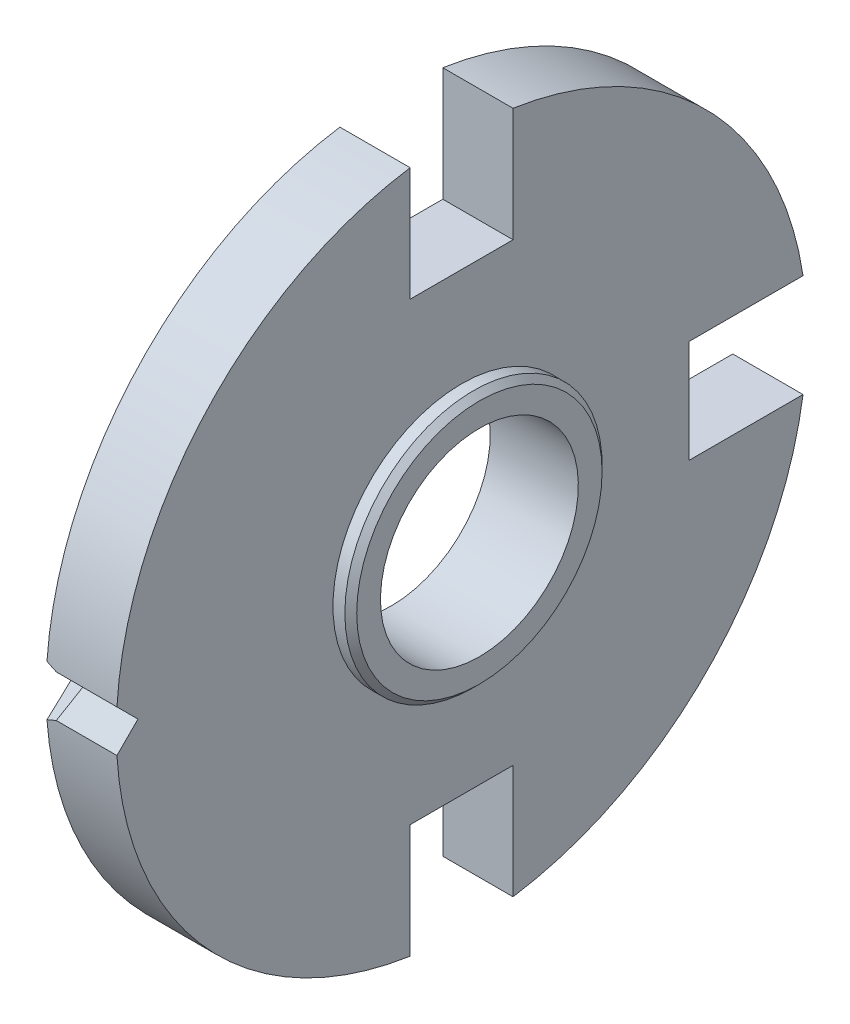
ISO-10303-21;
HEADER;
FILE_DESCRIPTION(('STEP AP214'),'2;1');
FILE_NAME('part.step','',(''),(''),'','','');
FILE_SCHEMA(('AUTOMOTIVE_DESIGN { 1 0 10303 214 1 1 1 1 }'));
ENDSEC;
DATA;
#1=APPLICATION_CONTEXT('core data for automotive mechanical design processes');
#2=APPLICATION_PROTOCOL_DEFINITION('international standard','automotive_design',2000,#1);
#3=PRODUCT_CONTEXT('',#1,'mechanical');
#4=PRODUCT('Part','Part','',(#3));
#5=PRODUCT_RELATED_PRODUCT_CATEGORY('part','',(#4));
#6=PRODUCT_DEFINITION_FORMATION('','',#4);
#7=PRODUCT_DEFINITION_CONTEXT('part definition',#1,'design');
#8=PRODUCT_DEFINITION('design','',#6,#7);
#9=PRODUCT_DEFINITION_SHAPE('','',#8);
#10=(LENGTH_UNIT() NAMED_UNIT(*) SI_UNIT(.MILLI.,.METRE.));
#11=(NAMED_UNIT(*) PLANE_ANGLE_UNIT() SI_UNIT($,.RADIAN.));
#12=(NAMED_UNIT(*) SI_UNIT($,.STERADIAN.) SOLID_ANGLE_UNIT());
#13=UNCERTAINTY_MEASURE_WITH_UNIT(LENGTH_MEASURE(1.E-05),#10,'distance_accuracy_value','');
#14=(GEOMETRIC_REPRESENTATION_CONTEXT(3) GLOBAL_UNCERTAINTY_ASSIGNED_CONTEXT((#13)) GLOBAL_UNIT_ASSIGNED_CONTEXT((#10,
#11,#12)) REPRESENTATION_CONTEXT('',''));
#15=CARTESIAN_POINT('',(0.,0.,0.));
#16=DIRECTION('',(0.,0.,1.));
#17=DIRECTION('',(1.,0.,0.));
#18=AXIS2_PLACEMENT_3D('',#15,#16,#17);
#19=CARTESIAN_POINT('',(122.75,0.,0.));
#20=DIRECTION('',(-1.,0.,0.));
#21=DIRECTION('',(0.,1.,0.));
#22=AXIS2_PLACEMENT_3D('',#19,#20,#21);
#23=CYLINDRICAL_SURFACE('',#22,6.5);
#24=CARTESIAN_POINT('',(122.3,0.,0.));
#25=DIRECTION('',(-1.,0.,0.));
#26=DIRECTION('',(0.,-1.,0.));
#27=AXIS2_PLACEMENT_3D('',#24,#25,#26);
#28=CIRCLE('',#27,6.5);
#29=CARTESIAN_POINT('',(122.3,-6.5,0.));
#30=VERTEX_POINT('',#29);
#31=EDGE_CURVE('E264',#30,#30,#28,.T.);
#32=ORIENTED_EDGE('',*,*,#31,.F.);
#33=DIRECTION('',(1.,0.,0.));
#34=VECTOR('',#33,1.);
#35=CARTESIAN_POINT('',(122.75,-6.5,0.));
#36=LINE('',#35,#34);
#37=CARTESIAN_POINT('',(122.9,-6.5,0.));
#38=VERTEX_POINT('',#37);
#39=EDGE_CURVE('E11',#30,#38,#36,.T.);
#40=ORIENTED_EDGE('',*,*,#39,.T.);
#41=CARTESIAN_POINT('',(122.9,0.,0.));
#42=DIRECTION('',(1.,0.,0.));
#43=DIRECTION('',(0.,0.,1.));
#44=AXIS2_PLACEMENT_3D('',#41,#42,#43);
#45=CIRCLE('',#44,6.5);
#46=CARTESIAN_POINT('',(122.9,0.,6.5));
#47=VERTEX_POINT('',#46);
#48=EDGE_CURVE('E28',#47,#38,#45,.T.);
#49=ORIENTED_EDGE('',*,*,#48,.F.);
#50=CARTESIAN_POINT('',(122.9,0.,0.));
#51=DIRECTION('',(1.,0.,0.));
#52=DIRECTION('',(0.,0.,1.));
#53=AXIS2_PLACEMENT_3D('',#50,#51,#52);
#54=CIRCLE('',#53,6.5);
#55=EDGE_CURVE('E231',#38,#47,#54,.T.);
#56=ORIENTED_EDGE('',*,*,#55,.F.);
#57=ORIENTED_EDGE('',*,*,#39,.F.);
#58=EDGE_LOOP('',(#32,#40,#49,#56,#57));
#59=FACE_BOUND('',#58,.T.);
#60=ADVANCED_FACE('F17',(#59),#23,.T.);
#61=CARTESIAN_POINT('',(123.05,0.,0.));
#62=DIRECTION('',(-1.,0.,0.));
#63=DIRECTION('',(0.,0.,-1.));
#64=AXIS2_PLACEMENT_3D('',#61,#62,#63);
#65=CONICAL_SURFACE('',#64,6.35,0.785398163397448);
#66=ORIENTED_EDGE('',*,*,#55,.T.);
#67=DIRECTION('',(0.707106781186548,0.,-0.707106781186548));
#68=VECTOR('',#67,1.);
#69=CARTESIAN_POINT('',(123.05,0.,6.35));
#70=LINE('',#69,#68);
#71=CARTESIAN_POINT('',(123.2,0.,6.2));
#72=VERTEX_POINT('',#71);
#73=EDGE_CURVE('E228',#47,#72,#70,.T.);
#74=ORIENTED_EDGE('',*,*,#73,.T.);
#75=CARTESIAN_POINT('',(123.2,0.,0.));
#76=DIRECTION('',(1.,0.,0.));
#77=DIRECTION('',(0.,0.,-1.));
#78=AXIS2_PLACEMENT_3D('',#75,#76,#77);
#79=CIRCLE('',#78,6.2);
#80=EDGE_CURVE('E344',#72,#72,#79,.T.);
#81=ORIENTED_EDGE('',*,*,#80,.F.);
#82=ORIENTED_EDGE('',*,*,#73,.F.);
#83=ORIENTED_EDGE('',*,*,#48,.T.);
#84=EDGE_LOOP('',(#66,#74,#81,#82,#83));
#85=FACE_BOUND('',#84,.T.);
#86=ADVANCED_FACE('F585',(#85),#65,.T.);
#87=CARTESIAN_POINT('',(123.2,5.75,0.));
#88=DIRECTION('',(1.,0.,0.));
#89=DIRECTION('',(0.,1.,0.));
#90=AXIS2_PLACEMENT_3D('',#87,#88,#89);
#91=PLANE('',#90);
#92=CARTESIAN_POINT('',(123.2,0.,0.));
#93=DIRECTION('',(-1.,0.,0.));
#94=DIRECTION('',(0.,-1.,0.));
#95=AXIS2_PLACEMENT_3D('',#92,#93,#94);
#96=CIRCLE('',#95,5.);
#97=CARTESIAN_POINT('',(123.2,-5.,0.));
#98=VERTEX_POINT('',#97);
#99=EDGE_CURVE('E222',#98,#98,#96,.T.);
#100=ORIENTED_EDGE('',*,*,#99,.T.);
#101=EDGE_LOOP('',(#100));
#102=FACE_BOUND('',#101,.T.);
#103=ORIENTED_EDGE('',*,*,#80,.T.);
#104=EDGE_LOOP('',(#103));
#105=FACE_BOUND('',#104,.T.);
#106=ADVANCED_FACE('F583',(#102,#105),#91,.T.);
#107=CARTESIAN_POINT('',(120.975,0.,0.));
#108=DIRECTION('',(-1.,0.,0.));
#109=DIRECTION('',(0.,1.,0.));
#110=AXIS2_PLACEMENT_3D('',#107,#108,#109);
#111=CYLINDRICAL_SURFACE('',#110,5.);
#112=ORIENTED_EDGE('',*,*,#99,.F.);
#113=DIRECTION('',(-1.,0.,0.));
#114=VECTOR('',#113,1.);
#115=CARTESIAN_POINT('',(120.975,-5.,0.));
#116=LINE('',#115,#114);
#117=CARTESIAN_POINT('',(118.75,-5.,0.));
#118=VERTEX_POINT('',#117);
#119=EDGE_CURVE('E225',#98,#118,#116,.T.);
#120=ORIENTED_EDGE('',*,*,#119,.T.);
#121=CARTESIAN_POINT('',(118.75,0.,0.));
#122=DIRECTION('',(1.,0.,0.));
#123=DIRECTION('',(0.,1.,0.));
#124=AXIS2_PLACEMENT_3D('',#121,#122,#123);
#125=CIRCLE('',#124,5.);
#126=EDGE_CURVE('E328',#118,#118,#125,.T.);
#127=ORIENTED_EDGE('',*,*,#126,.F.);
#128=ORIENTED_EDGE('',*,*,#119,.F.);
#129=EDGE_LOOP('',(#112,#120,#127,#128));
#130=FACE_BOUND('',#129,.T.);
#131=ADVANCED_FACE('F665',(#130),#111,.F.);
#132=CARTESIAN_POINT('',(118.75,2.6,-11.5));
#133=DIRECTION('',(0.,1.,0.));
#134=DIRECTION('',(1.,0.,0.));
#135=AXIS2_PLACEMENT_3D('',#132,#133,#134);
#136=PLANE('',#135);
#137=DIRECTION('',(0.,0.,1.));
#138=VECTOR('',#137,1.);
#139=CARTESIAN_POINT('',(122.3,2.6,-17.25521660252));
#140=LINE('',#139,#138);
#141=CARTESIAN_POINT('',(122.3,2.6,-17.25521660252));
#142=VERTEX_POINT('',#141);
#143=CARTESIAN_POINT('',(122.3,2.6,-11.5));
#144=VERTEX_POINT('',#143);
#145=EDGE_CURVE('E21',#142,#144,#140,.T.);
#146=ORIENTED_EDGE('',*,*,#145,.T.);
#147=DIRECTION('',(-1.,0.,0.));
#148=VECTOR('',#147,1.);
#149=CARTESIAN_POINT('',(122.3,2.6,-11.5));
#150=LINE('',#149,#148);
#151=CARTESIAN_POINT('',(118.75,2.6,-11.5));
#152=VERTEX_POINT('',#151);
#153=EDGE_CURVE('E226',#144,#152,#150,.T.);
#154=ORIENTED_EDGE('',*,*,#153,.T.);
#155=DIRECTION('',(0.,0.,-1.));
#156=VECTOR('',#155,1.);
#157=CARTESIAN_POINT('',(118.75,2.6,-11.5));
#158=LINE('',#157,#156);
#159=CARTESIAN_POINT('',(118.75,2.6,-17.25521660252));
#160=VERTEX_POINT('',#159);
#161=EDGE_CURVE('E243',#152,#160,#158,.T.);
#162=ORIENTED_EDGE('',*,*,#161,.T.);
#163=DIRECTION('',(-1.,0.,0.));
#164=VECTOR('',#163,1.);
#165=CARTESIAN_POINT('',(122.3,2.6,-17.25521660252));
#166=LINE('',#165,#164);
#167=EDGE_CURVE('E283',#142,#160,#166,.T.);
#168=ORIENTED_EDGE('',*,*,#167,.F.);
#169=EDGE_LOOP('',(#146,#154,#162,#168));
#170=FACE_BOUND('',#169,.T.);
#171=ADVANCED_FACE('F624',(#170),#136,.F.);
#172=CARTESIAN_POINT('',(118.75,-2.6,-11.5));
#173=DIRECTION('',(0.,0.,1.));
#174=DIRECTION('',(1.,0.,0.));
#175=AXIS2_PLACEMENT_3D('',#172,#173,#174);
#176=PLANE('',#175);
#177=DIRECTION('',(0.,-1.,0.));
#178=VECTOR('',#177,1.);
#179=CARTESIAN_POINT('',(122.3,2.6,-11.5));
#180=LINE('',#179,#178);
#181=CARTESIAN_POINT('',(122.3,-2.6,-11.5));
#182=VERTEX_POINT('',#181);
#183=EDGE_CURVE('E268',#144,#182,#180,.T.);
#184=ORIENTED_EDGE('',*,*,#183,.T.);
#185=DIRECTION('',(-1.,0.,0.));
#186=VECTOR('',#185,1.);
#187=CARTESIAN_POINT('',(122.3,-2.6,-11.5));
#188=LINE('',#187,#186);
#189=CARTESIAN_POINT('',(118.75,-2.6,-11.5));
#190=VERTEX_POINT('',#189);
#191=EDGE_CURVE('E282',#182,#190,#188,.T.);
#192=ORIENTED_EDGE('',*,*,#191,.T.);
#193=DIRECTION('',(0.,1.,0.));
#194=VECTOR('',#193,1.);
#195=CARTESIAN_POINT('',(118.75,-2.6,-11.5));
#196=LINE('',#195,#194);
#197=EDGE_CURVE('E238',#190,#152,#196,.T.);
#198=ORIENTED_EDGE('',*,*,#197,.T.);
#199=ORIENTED_EDGE('',*,*,#153,.F.);
#200=EDGE_LOOP('',(#184,#192,#198,#199));
#201=FACE_BOUND('',#200,.T.);
#202=ADVANCED_FACE('F620',(#201),#176,.F.);
#203=CARTESIAN_POINT('',(118.75,-2.6,-17.45));
#204=DIRECTION('',(0.,-1.,0.));
#205=DIRECTION('',(0.,0.,-1.));
#206=AXIS2_PLACEMENT_3D('',#203,#204,#205);
#207=PLANE('',#206);
#208=DIRECTION('',(0.,0.,-1.));
#209=VECTOR('',#208,1.);
#210=CARTESIAN_POINT('',(122.3,-2.6,-11.5));
#211=LINE('',#210,#209);
#212=CARTESIAN_POINT('',(122.3,-2.6,-17.25521660252));
#213=VERTEX_POINT('',#212);
#214=EDGE_CURVE('E220',#182,#213,#211,.T.);
#215=ORIENTED_EDGE('',*,*,#214,.T.);
#216=DIRECTION('',(1.,0.,0.));
#217=VECTOR('',#216,1.);
#218=CARTESIAN_POINT('',(118.75,-2.6,-17.25521660252));
#219=LINE('',#218,#217);
#220=CARTESIAN_POINT('',(118.75,-2.6,-17.25521660252));
#221=VERTEX_POINT('',#220);
#222=EDGE_CURVE('E316',#221,#213,#219,.T.);
#223=ORIENTED_EDGE('',*,*,#222,.F.);
#224=DIRECTION('',(0.,0.,1.));
#225=VECTOR('',#224,1.);
#226=CARTESIAN_POINT('',(118.75,-2.6,-17.25521660252));
#227=LINE('',#226,#225);
#228=EDGE_CURVE('E242',#221,#190,#227,.T.);
#229=ORIENTED_EDGE('',*,*,#228,.T.);
#230=ORIENTED_EDGE('',*,*,#191,.F.);
#231=EDGE_LOOP('',(#215,#223,#229,#230));
#232=FACE_BOUND('',#231,.T.);
#233=ADVANCED_FACE('F613',(#232),#207,.F.);
#234=CARTESIAN_POINT('',(120.525,0.,0.));
#235=DIRECTION('',(-1.,0.,0.));
#236=DIRECTION('',(0.,1.,0.));
#237=AXIS2_PLACEMENT_3D('',#234,#235,#236);
#238=CYLINDRICAL_SURFACE('',#237,17.45);
#239=ORIENTED_EDGE('',*,*,#222,.T.);
#240=CARTESIAN_POINT('',(122.3,0.,0.));
#241=DIRECTION('',(1.,0.,0.));
#242=DIRECTION('',(0.,-0.988837627651771,-0.148997134670496));
#243=AXIS2_PLACEMENT_3D('',#240,#241,#242);
#244=CIRCLE('',#243,17.45);
#245=CARTESIAN_POINT('',(122.3,-17.25521660252,-2.6));
#246=VERTEX_POINT('',#245);
#247=EDGE_CURVE('E216',#246,#213,#244,.T.);
#248=ORIENTED_EDGE('',*,*,#247,.F.);
#249=DIRECTION('',(-1.,0.,0.));
#250=VECTOR('',#249,1.);
#251=CARTESIAN_POINT('',(122.3,-17.25521660252,-2.6));
#252=LINE('',#251,#250);
#253=CARTESIAN_POINT('',(118.75,-17.25521660252,-2.6));
#254=VERTEX_POINT('',#253);
#255=EDGE_CURVE('E254',#246,#254,#252,.T.);
#256=ORIENTED_EDGE('',*,*,#255,.T.);
#257=CARTESIAN_POINT('',(118.75,0.,0.));
#258=DIRECTION('',(-1.,0.,0.));
#259=DIRECTION('',(0.,-0.148997134670496,-0.988837627651771));
#260=AXIS2_PLACEMENT_3D('',#257,#258,#259);
#261=CIRCLE('',#260,17.45);
#262=EDGE_CURVE('E208',#221,#254,#261,.T.);
#263=ORIENTED_EDGE('',*,*,#262,.F.);
#264=EDGE_LOOP('',(#239,#248,#256,#263));
#265=FACE_BOUND('',#264,.T.);
#266=ADVANCED_FACE('F608',(#265),#238,.T.);
#267=CARTESIAN_POINT('',(118.75,-11.5,-2.6));
#268=DIRECTION('',(0.,0.,-1.));
#269=DIRECTION('',(0.,-1.,0.));
#270=AXIS2_PLACEMENT_3D('',#267,#268,#269);
#271=PLANE('',#270);
#272=ORIENTED_EDGE('',*,*,#255,.F.);
#273=DIRECTION('',(0.,1.,0.));
#274=VECTOR('',#273,1.);
#275=CARTESIAN_POINT('',(122.3,-17.25521660252,-2.6));
#276=LINE('',#275,#274);
#277=CARTESIAN_POINT('',(122.3,-11.5,-2.6));
#278=VERTEX_POINT('',#277);
#279=EDGE_CURVE('E221',#246,#278,#276,.T.);
#280=ORIENTED_EDGE('',*,*,#279,.T.);
#281=DIRECTION('',(-1.,0.,0.));
#282=VECTOR('',#281,1.);
#283=CARTESIAN_POINT('',(122.3,-11.5,-2.6));
#284=LINE('',#283,#282);
#285=CARTESIAN_POINT('',(118.75,-11.5,-2.6));
#286=VERTEX_POINT('',#285);
#287=EDGE_CURVE('E186',#278,#286,#284,.T.);
#288=ORIENTED_EDGE('',*,*,#287,.T.);
#289=DIRECTION('',(0.,-1.,0.));
#290=VECTOR('',#289,1.);
#291=CARTESIAN_POINT('',(118.75,-11.5,-2.6));
#292=LINE('',#291,#290);
#293=EDGE_CURVE('E201',#286,#254,#292,.T.);
#294=ORIENTED_EDGE('',*,*,#293,.T.);
#295=EDGE_LOOP('',(#272,#280,#288,#294));
#296=FACE_BOUND('',#295,.T.);
#297=ADVANCED_FACE('F605',(#296),#271,.F.);
#298=CARTESIAN_POINT('',(118.75,-11.5,2.6));
#299=DIRECTION('',(0.,1.,0.));
#300=DIRECTION('',(1.,0.,0.));
#301=AXIS2_PLACEMENT_3D('',#298,#299,#300);
#302=PLANE('',#301);
#303=DIRECTION('',(0.,0.,1.));
#304=VECTOR('',#303,1.);
#305=CARTESIAN_POINT('',(122.3,-11.5,-2.6));
#306=LINE('',#305,#304);
#307=CARTESIAN_POINT('',(122.3,-11.5,2.6));
#308=VERTEX_POINT('',#307);
#309=EDGE_CURVE('E181',#278,#308,#306,.T.);
#310=ORIENTED_EDGE('',*,*,#309,.T.);
#311=DIRECTION('',(-1.,0.,0.));
#312=VECTOR('',#311,1.);
#313=CARTESIAN_POINT('',(122.3,-11.5,2.6));
#314=LINE('',#313,#312);
#315=CARTESIAN_POINT('',(118.75,-11.5,2.6));
#316=VERTEX_POINT('',#315);
#317=EDGE_CURVE('E174',#308,#316,#314,.T.);
#318=ORIENTED_EDGE('',*,*,#317,.T.);
#319=DIRECTION('',(0.,0.,-1.));
#320=VECTOR('',#319,1.);
#321=CARTESIAN_POINT('',(118.75,-11.5,2.6));
#322=LINE('',#321,#320);
#323=EDGE_CURVE('E178',#316,#286,#322,.T.);
#324=ORIENTED_EDGE('',*,*,#323,.T.);
#325=ORIENTED_EDGE('',*,*,#287,.F.);
#326=EDGE_LOOP('',(#310,#318,#324,#325));
#327=FACE_BOUND('',#326,.T.);
#328=ADVANCED_FACE('F176',(#327),#302,.F.);
#329=CARTESIAN_POINT('',(118.75,-17.45,2.6));
#330=DIRECTION('',(0.,0.,1.));
#331=DIRECTION('',(1.,0.,0.));
#332=AXIS2_PLACEMENT_3D('',#329,#330,#331);
#333=PLANE('',#332);
#334=DIRECTION('',(0.,-1.,0.));
#335=VECTOR('',#334,1.);
#336=CARTESIAN_POINT('',(122.3,-11.5,2.6));
#337=LINE('',#336,#335);
#338=CARTESIAN_POINT('',(122.3,-17.25521660252,2.6));
#339=VERTEX_POINT('',#338);
#340=EDGE_CURVE('E434',#308,#339,#337,.T.);
#341=ORIENTED_EDGE('',*,*,#340,.T.);
#342=DIRECTION('',(1.,0.,0.));
#343=VECTOR('',#342,1.);
#344=CARTESIAN_POINT('',(118.75,-17.25521660252,2.6));
#345=LINE('',#344,#343);
#346=CARTESIAN_POINT('',(118.75,-17.25521660252,2.6));
#347=VERTEX_POINT('',#346);
#348=EDGE_CURVE('E187',#347,#339,#345,.T.);
#349=ORIENTED_EDGE('',*,*,#348,.F.);
#350=DIRECTION('',(0.,1.,0.));
#351=VECTOR('',#350,1.);
#352=CARTESIAN_POINT('',(118.75,-17.25521660252,2.6));
#353=LINE('',#352,#351);
#354=EDGE_CURVE('E190',#347,#316,#353,.T.);
#355=ORIENTED_EDGE('',*,*,#354,.T.);
#356=ORIENTED_EDGE('',*,*,#317,.F.);
#357=EDGE_LOOP('',(#341,#349,#355,#356));
#358=FACE_BOUND('',#357,.T.);
#359=ADVANCED_FACE('F191',(#358),#333,.F.);
#360=CARTESIAN_POINT('',(120.525,0.,0.));
#361=DIRECTION('',(-1.,0.,0.));
#362=DIRECTION('',(0.,1.,0.));
#363=AXIS2_PLACEMENT_3D('',#360,#361,#362);
#364=CYLINDRICAL_SURFACE('',#363,17.45);
#365=CARTESIAN_POINT('',(118.750000000729,-1.27656980975551,17.4032430748071));
#366=CARTESIAN_POINT('',(118.914146337813,-1.21113997958318,17.4080425104925));
#367=CARTESIAN_POINT('',(119.075776758169,-1.13966539592839,17.412913506836));
#368=CARTESIAN_POINT('',(119.235503689173,-1.06303552015676,17.4175904040394));
#369=(BOUNDED_CURVE() B_SPLINE_CURVE(3,(#365,#366,#367,#368),.UNSPECIFIED.,.F.,
.F.) B_SPLINE_CURVE_WITH_KNOTS((4,4),(-1.84464061663477,-1.7865873168469),
.UNSPECIFIED.) CURVE() GEOMETRIC_REPRESENTATION_ITEM() RATIONAL_B_SPLINE_CURVE((1.,1.,1.,1.)) REPRESENTATION_ITEM(''));
#370=CARTESIAN_POINT('',(118.750000000398,-1.27656980889565,17.4032430744201));
#371=VERTEX_POINT('',#370);
#372=CARTESIAN_POINT('',(119.235503689117,-1.06303552007139,17.4175904045304));
#373=VERTEX_POINT('',#372);
#374=EDGE_CURVE('E311',#371,#373,#369,.T.);
#375=ORIENTED_EDGE('',*,*,#374,.F.);
#376=CARTESIAN_POINT('',(118.75,0.,0.));
#377=DIRECTION('',(-1.,0.,0.));
#378=DIRECTION('',(0.,-0.988837627651771,0.148997134670496));
#379=AXIS2_PLACEMENT_3D('',#376,#377,#378);
#380=CIRCLE('',#379,17.45);
#381=EDGE_CURVE('E195',#347,#371,#380,.T.);
#382=ORIENTED_EDGE('',*,*,#381,.F.);
#383=ORIENTED_EDGE('',*,*,#348,.T.);
#384=CARTESIAN_POINT('',(122.3,0.,0.));
#385=DIRECTION('',(1.,0.,0.));
#386=DIRECTION('',(0.,-0.0609189409234106,0.998142716567511));
#387=AXIS2_PLACEMENT_3D('',#384,#385,#386);
#388=CIRCLE('',#387,17.45);
#389=CARTESIAN_POINT('',(122.3,-1.063035519113,17.4175904041));
#390=VERTEX_POINT('',#389);
#391=EDGE_CURVE('E299',#390,#339,#388,.T.);
#392=ORIENTED_EDGE('',*,*,#391,.F.);
#393=DIRECTION('',(-1.,0.,0.));
#394=VECTOR('',#393,1.);
#395=CARTESIAN_POINT('',(120.525,-1.06303551911592,17.4175904041029));
#396=LINE('',#395,#394);
#397=EDGE_CURVE('E251',#390,#373,#396,.T.);
#398=ORIENTED_EDGE('',*,*,#397,.T.);
#399=EDGE_LOOP('',(#375,#382,#383,#392,#398));
#400=FACE_BOUND('',#399,.T.);
#401=ADVANCED_FACE('F368',(#400),#364,.T.);
#402=CARTESIAN_POINT('',(123.75,3.535533905933,19.89008879092));
#403=DIRECTION('',(0.,-0.707106781186548,0.707106781186548));
#404=DIRECTION('',(-1.,0.,0.));
#405=AXIS2_PLACEMENT_3D('',#402,#403,#404);
#406=PLANE('',#405);
#407=CARTESIAN_POINT('',(119.508692146074,-1.65201186064223E-12,16.3545548849853));
#408=CARTESIAN_POINT('',(119.372097918579,0.559124252789758,16.9136791377768));
#409=CARTESIAN_POINT('',(119.235503691084,1.06303552007375,17.4175904050608));
#410=(BOUNDED_CURVE() B_SPLINE_CURVE(2,(#407,#408,#409),.UNSPECIFIED.,.F.,
.F.) B_SPLINE_CURVE_WITH_KNOTS((3,3),(-0.343159029699654,-0.193709526089807),
.UNSPECIFIED.) CURVE() GEOMETRIC_REPRESENTATION_ITEM() RATIONAL_B_SPLINE_CURVE((1.,1.,1.)) REPRESENTATION_ITEM(''));
#411=CARTESIAN_POINT('',(119.5086921461,0.,16.35455488499));
#412=VERTEX_POINT('',#411);
#413=CARTESIAN_POINT('',(119.235503689119,1.06303552007139,17.4175904045304));
#414=VERTEX_POINT('',#413);
#415=EDGE_CURVE('E497',#412,#414,#410,.T.);
#416=ORIENTED_EDGE('',*,*,#415,.F.);
#417=DIRECTION('',(1.,0.,0.));
#418=VECTOR('',#417,1.);
#419=CARTESIAN_POINT('',(119.5086921461,0.,16.35455488499));
#420=LINE('',#419,#418);
#421=CARTESIAN_POINT('',(122.3,0.,16.35455488499));
#422=VERTEX_POINT('',#421);
#423=EDGE_CURVE('E247',#412,#422,#420,.T.);
#424=ORIENTED_EDGE('',*,*,#423,.T.);
#425=DIRECTION('',(0.,-0.707106781186597,-0.707106781186498));
#426=VECTOR('',#425,1.);
#427=CARTESIAN_POINT('',(122.3,1.063035519113,17.4175904041));
#428=LINE('',#427,#426);
#429=CARTESIAN_POINT('',(122.3,1.063035519113,17.4175904041));
#430=VERTEX_POINT('',#429);
#431=EDGE_CURVE('E259',#430,#422,#428,.T.);
#432=ORIENTED_EDGE('',*,*,#431,.F.);
#433=DIRECTION('',(1.,0.,0.));
#434=VECTOR('',#433,1.);
#435=CARTESIAN_POINT('',(120.525,1.06303551911592,17.4175904041029));
#436=LINE('',#435,#434);
#437=EDGE_CURVE('E317',#414,#430,#436,.T.);
#438=ORIENTED_EDGE('',*,*,#437,.F.);
#439=EDGE_LOOP('',(#416,#424,#432,#438));
#440=FACE_BOUND('',#439,.T.);
#441=ADVANCED_FACE('F19',(#440),#406,.T.);
#442=CARTESIAN_POINT('',(118.75,11.5,-2.6));
#443=DIRECTION('',(0.,-1.,0.));
#444=DIRECTION('',(0.,0.,-1.));
#445=AXIS2_PLACEMENT_3D('',#442,#443,#444);
#446=PLANE('',#445);
#447=DIRECTION('',(0.,0.,-1.));
#448=VECTOR('',#447,1.);
#449=CARTESIAN_POINT('',(122.3,11.5,2.6));
#450=LINE('',#449,#448);
#451=CARTESIAN_POINT('',(122.3,11.5,2.6));
#452=VERTEX_POINT('',#451);
#453=CARTESIAN_POINT('',(122.3,11.5,-2.6));
#454=VERTEX_POINT('',#453);
#455=EDGE_CURVE('E325',#452,#454,#450,.T.);
#456=ORIENTED_EDGE('',*,*,#455,.T.);
#457=DIRECTION('',(-1.,0.,0.));
#458=VECTOR('',#457,1.);
#459=CARTESIAN_POINT('',(122.3,11.5,-2.6));
#460=LINE('',#459,#458);
#461=CARTESIAN_POINT('',(118.75,11.5,-2.6));
#462=VERTEX_POINT('',#461);
#463=EDGE_CURVE('E271',#454,#462,#460,.T.);
#464=ORIENTED_EDGE('',*,*,#463,.T.);
#465=DIRECTION('',(0.,0.,1.));
#466=VECTOR('',#465,1.);
#467=CARTESIAN_POINT('',(118.75,11.5,-2.6));
#468=LINE('',#467,#466);
#469=CARTESIAN_POINT('',(118.75,11.5,2.6));
#470=VERTEX_POINT('',#469);
#471=EDGE_CURVE('E236',#462,#470,#468,.T.);
#472=ORIENTED_EDGE('',*,*,#471,.T.);
#473=DIRECTION('',(-1.,0.,0.));
#474=VECTOR('',#473,1.);
#475=CARTESIAN_POINT('',(122.3,11.5,2.6));
#476=LINE('',#475,#474);
#477=EDGE_CURVE('E501',#452,#470,#476,.T.);
#478=ORIENTED_EDGE('',*,*,#477,.F.);
#479=EDGE_LOOP('',(#456,#464,#472,#478));
#480=FACE_BOUND('',#479,.T.);
#481=ADVANCED_FACE('F635',(#480),#446,.F.);
#482=CARTESIAN_POINT('',(118.75,11.5,2.6));
#483=DIRECTION('',(0.,0.,1.));
#484=DIRECTION('',(1.,0.,0.));
#485=AXIS2_PLACEMENT_3D('',#482,#483,#484);
#486=PLANE('',#485);
#487=DIRECTION('',(0.,-1.,0.));
#488=VECTOR('',#487,1.);
#489=CARTESIAN_POINT('',(122.3,17.25521660252,2.6));
#490=LINE('',#489,#488);
#491=CARTESIAN_POINT('',(122.3,17.25521660252,2.6));
#492=VERTEX_POINT('',#491);
#493=EDGE_CURVE('E260',#492,#452,#490,.T.);
#494=ORIENTED_EDGE('',*,*,#493,.T.);
#495=ORIENTED_EDGE('',*,*,#477,.T.);
#496=DIRECTION('',(0.,1.,0.));
#497=VECTOR('',#496,1.);
#498=CARTESIAN_POINT('',(118.75,11.5,2.6));
#499=LINE('',#498,#497);
#500=CARTESIAN_POINT('',(118.75,17.25521660252,2.6));
#501=VERTEX_POINT('',#500);
#502=EDGE_CURVE('E232',#470,#501,#499,.T.);
#503=ORIENTED_EDGE('',*,*,#502,.T.);
#504=DIRECTION('',(-1.,0.,0.));
#505=VECTOR('',#504,1.);
#506=CARTESIAN_POINT('',(122.3,17.25521660252,2.6));
#507=LINE('',#506,#505);
#508=EDGE_CURVE('E320',#492,#501,#507,.T.);
#509=ORIENTED_EDGE('',*,*,#508,.F.);
#510=EDGE_LOOP('',(#494,#495,#503,#509));
#511=FACE_BOUND('',#510,.T.);
#512=ADVANCED_FACE('F642',(#511),#486,.F.);
#513=CARTESIAN_POINT('',(120.525,0.,0.));
#514=DIRECTION('',(-1.,0.,0.));
#515=DIRECTION('',(0.,1.,0.));
#516=AXIS2_PLACEMENT_3D('',#513,#514,#515);
#517=CYLINDRICAL_SURFACE('',#516,17.45);
#518=CARTESIAN_POINT('',(119.235503689174,1.06303552015677,17.4175904040394));
#519=CARTESIAN_POINT('',(119.075775332155,1.13966608006735,17.4129134650814));
#520=CARTESIAN_POINT('',(118.91413960424,1.2111426636524,17.4080423136107));
#521=CARTESIAN_POINT('',(118.75,1.27656981004698,17.4032430747857));
#522=(BOUNDED_CURVE() B_SPLINE_CURVE(3,(#518,#519,#520,#521),.UNSPECIFIED.,.F.,
.F.) B_SPLINE_CURVE_WITH_KNOTS((4,4),(-2.3418524631324,-2.28379916325835),
.UNSPECIFIED.) CURVE() GEOMETRIC_REPRESENTATION_ITEM() RATIONAL_B_SPLINE_CURVE((1.,1.,1.,1.)) REPRESENTATION_ITEM(''));
#523=CARTESIAN_POINT('',(118.75,1.276569810047,17.40324307479));
#524=VERTEX_POINT('',#523);
#525=EDGE_CURVE('E321',#414,#524,#522,.T.);
#526=ORIENTED_EDGE('',*,*,#525,.F.);
#527=ORIENTED_EDGE('',*,*,#437,.T.);
#528=CARTESIAN_POINT('',(122.3,0.,0.));
#529=DIRECTION('',(1.,0.,0.));
#530=DIRECTION('',(0.,0.988837627651771,0.148997134670496));
#531=AXIS2_PLACEMENT_3D('',#528,#529,#530);
#532=CIRCLE('',#531,17.45);
#533=EDGE_CURVE('E255',#492,#430,#532,.T.);
#534=ORIENTED_EDGE('',*,*,#533,.F.);
#535=ORIENTED_EDGE('',*,*,#508,.T.);
#536=CARTESIAN_POINT('',(118.75,0.,0.));
#537=DIRECTION('',(-1.,0.,0.));
#538=DIRECTION('',(0.,0.073155863039922,0.997320520045028));
#539=AXIS2_PLACEMENT_3D('',#536,#537,#538);
#540=CIRCLE('',#539,17.45);
#541=EDGE_CURVE('E237',#524,#501,#540,.T.);
#542=ORIENTED_EDGE('',*,*,#541,.F.);
#543=EDGE_LOOP('',(#526,#527,#534,#535,#542));
#544=FACE_BOUND('',#543,.T.);
#545=ADVANCED_FACE('F644',(#544),#517,.T.);
#546=CARTESIAN_POINT('',(116.7422,0.6382797957864,21.6787));
#547=DIRECTION('',(0.,-1.,0.));
#548=DIRECTION('',(0.,0.,-1.));
#549=AXIS2_PLACEMENT_3D('',#546,#547,#548);
#550=CONICAL_SURFACE('',#549,5.361720204214,0.785398163397448);
#551=CARTESIAN_POINT('',(118.75,1.27656981004942,17.4032430747883));
#552=CARTESIAN_POINT('',(118.75,0.726905357888125,16.7959859527784));
#553=CARTESIAN_POINT('',(118.75,8.99233154766219E-13,16.0246095196492));
#554=(BOUNDED_CURVE() B_SPLINE_CURVE(2,(#551,#552,#553),.UNSPECIFIED.,.F.,
.F.) B_SPLINE_CURVE_WITH_KNOTS((3,3),(5.55230447325372,5.80539197298008),
.UNSPECIFIED.) CURVE() GEOMETRIC_REPRESENTATION_ITEM() RATIONAL_B_SPLINE_CURVE((3.90166668816818,
3.6071139459456,3.27967938791246)) REPRESENTATION_ITEM(''));
#555=CARTESIAN_POINT('',(118.75,0.,16.02460951965));
#556=VERTEX_POINT('',#555);
#557=EDGE_CURVE('E300',#524,#556,#554,.T.);
#558=ORIENTED_EDGE('',*,*,#557,.T.);
#559=CARTESIAN_POINT('',(116.7422,0.,21.6787));
#560=DIRECTION('',(0.,-1.,0.));
#561=DIRECTION('',(0.334633333333302,0.,-0.942348413391906));
#562=AXIS2_PLACEMENT_3D('',#559,#560,#561);
#563=CIRCLE('',#562,6.);
#564=EDGE_CURVE('E305',#556,#412,#563,.T.);
#565=ORIENTED_EDGE('',*,*,#564,.T.);
#566=ORIENTED_EDGE('',*,*,#415,.T.);
#567=ORIENTED_EDGE('',*,*,#525,.T.);
#568=EDGE_LOOP('',(#558,#565,#566,#567));
#569=FACE_BOUND('',#568,.T.);
#570=ADVANCED_FACE('F600',(#569),#550,.F.);
#571=CARTESIAN_POINT('',(118.75,11.225,0.));
#572=DIRECTION('',(-1.,0.,0.));
#573=DIRECTION('',(0.,0.,1.));
#574=AXIS2_PLACEMENT_3D('',#571,#572,#573);
#575=PLANE('',#574);
#576=ORIENTED_EDGE('',*,*,#126,.T.);
#577=EDGE_LOOP('',(#576));
#578=FACE_BOUND('',#577,.T.);
#579=ORIENTED_EDGE('',*,*,#557,.F.);
#580=ORIENTED_EDGE('',*,*,#541,.T.);
#581=ORIENTED_EDGE('',*,*,#502,.F.);
#582=ORIENTED_EDGE('',*,*,#471,.F.);
#583=DIRECTION('',(0.,-1.,0.));
#584=VECTOR('',#583,1.);
#585=CARTESIAN_POINT('',(118.75,17.25521660252,-2.6));
#586=LINE('',#585,#584);
#587=CARTESIAN_POINT('',(118.75,17.25521660252,-2.6));
#588=VERTEX_POINT('',#587);
#589=EDGE_CURVE('E276',#588,#462,#586,.T.);
#590=ORIENTED_EDGE('',*,*,#589,.F.);
#591=CARTESIAN_POINT('',(118.75,0.,0.));
#592=DIRECTION('',(-1.,0.,0.));
#593=DIRECTION('',(0.,0.988837627651771,-0.148997134670496));
#594=AXIS2_PLACEMENT_3D('',#591,#592,#593);
#595=CIRCLE('',#594,17.45);
#596=EDGE_CURVE('E287',#588,#160,#595,.T.);
#597=ORIENTED_EDGE('',*,*,#596,.T.);
#598=ORIENTED_EDGE('',*,*,#161,.F.);
#599=ORIENTED_EDGE('',*,*,#197,.F.);
#600=ORIENTED_EDGE('',*,*,#228,.F.);
#601=ORIENTED_EDGE('',*,*,#262,.T.);
#602=ORIENTED_EDGE('',*,*,#293,.F.);
#603=ORIENTED_EDGE('',*,*,#323,.F.);
#604=ORIENTED_EDGE('',*,*,#354,.F.);
#605=ORIENTED_EDGE('',*,*,#381,.T.);
#606=CARTESIAN_POINT('',(118.75,-4.65662222442553E-13,16.0246095196496));
#607=CARTESIAN_POINT('',(118.75,-0.726905357430586,16.7959859522937));
#608=CARTESIAN_POINT('',(118.75,-1.27656980934605,17.4032430740122));
#609=(BOUNDED_CURVE() B_SPLINE_CURVE(2,(#606,#607,#608),.UNSPECIFIED.,.F.,
.F.) B_SPLINE_CURVE_WITH_KNOTS((3,3),(-5.80539197297981,-5.55230447342847),
.UNSPECIFIED.) CURVE() GEOMETRIC_REPRESENTATION_ITEM() RATIONAL_B_SPLINE_CURVE((3.2796793879125,
3.6071139457192,3.90166668776082)) REPRESENTATION_ITEM(''));
#610=EDGE_CURVE('E250',#556,#371,#609,.T.);
#611=ORIENTED_EDGE('',*,*,#610,.F.);
#612=EDGE_LOOP('',(#579,#580,#581,#582,#590,#597,#598,#599,#600,#601,#602,#603,#604,#605,#611));
#613=FACE_BOUND('',#612,.T.);
#614=ADVANCED_FACE('F198',(#578,#613),#575,.T.);
#615=CARTESIAN_POINT('',(116.7422,-0.6382797957526,21.6787));
#616=DIRECTION('',(0.,1.,0.));
#617=DIRECTION('',(0.,0.,-1.));
#618=AXIS2_PLACEMENT_3D('',#615,#616,#617);
#619=CONICAL_SURFACE('',#618,5.361720204247,0.785398163397448);
#620=ORIENTED_EDGE('',*,*,#610,.T.);
#621=ORIENTED_EDGE('',*,*,#374,.T.);
#622=CARTESIAN_POINT('',(119.235503691083,-1.06303552007376,17.4175904050608));
#623=CARTESIAN_POINT('',(119.372097918578,-0.55912425278967,16.9136791377767));
#624=CARTESIAN_POINT('',(119.508692146072,1.85829129861759E-12,16.3545548849851));
#625=(BOUNDED_CURVE() B_SPLINE_CURVE(2,(#622,#623,#624),.UNSPECIFIED.,.F.,
.F.) B_SPLINE_CURVE_WITH_KNOTS((3,3),(0.193709334133532,0.343158848286883),
.UNSPECIFIED.) CURVE() GEOMETRIC_REPRESENTATION_ITEM() RATIONAL_B_SPLINE_CURVE((1.,1.,1.)) REPRESENTATION_ITEM(''));
#626=EDGE_CURVE('E212',#373,#412,#625,.T.);
#627=ORIENTED_EDGE('',*,*,#626,.T.);
#628=ORIENTED_EDGE('',*,*,#564,.F.);
#629=EDGE_LOOP('',(#620,#621,#627,#628));
#630=FACE_BOUND('',#629,.T.);
#631=ADVANCED_FACE('F361',(#630),#619,.F.);
#632=CARTESIAN_POINT('',(123.75,-3.535533905933,19.89008879092));
#633=DIRECTION('',(0.,0.707106781186548,0.707106781186548));
#634=DIRECTION('',(1.,0.,0.));
#635=AXIS2_PLACEMENT_3D('',#632,#633,#634);
#636=PLANE('',#635);
#637=ORIENTED_EDGE('',*,*,#626,.F.);
#638=ORIENTED_EDGE('',*,*,#397,.F.);
#639=DIRECTION('',(0.,-0.707106781186598,0.707106781186497));
#640=VECTOR('',#639,1.);
#641=CARTESIAN_POINT('',(122.3,0.,16.35455488499));
#642=LINE('',#641,#640);
#643=EDGE_CURVE('E275',#422,#390,#642,.T.);
#644=ORIENTED_EDGE('',*,*,#643,.F.);
#645=ORIENTED_EDGE('',*,*,#423,.F.);
#646=EDGE_LOOP('',(#637,#638,#644,#645));
#647=FACE_BOUND('',#646,.T.);
#648=ADVANCED_FACE('F373',(#647),#636,.T.);
#649=CARTESIAN_POINT('',(122.3,11.975,0.));
#650=DIRECTION('',(1.,0.,0.));
#651=DIRECTION('',(0.,1.,0.));
#652=AXIS2_PLACEMENT_3D('',#649,#650,#651);
#653=PLANE('',#652);
#654=ORIENTED_EDGE('',*,*,#31,.T.);
#655=EDGE_LOOP('',(#654));
#656=FACE_BOUND('',#655,.T.);
#657=ORIENTED_EDGE('',*,*,#643,.T.);
#658=ORIENTED_EDGE('',*,*,#391,.T.);
#659=ORIENTED_EDGE('',*,*,#340,.F.);
#660=ORIENTED_EDGE('',*,*,#309,.F.);
#661=ORIENTED_EDGE('',*,*,#279,.F.);
#662=ORIENTED_EDGE('',*,*,#247,.T.);
#663=ORIENTED_EDGE('',*,*,#214,.F.);
#664=ORIENTED_EDGE('',*,*,#183,.F.);
#665=ORIENTED_EDGE('',*,*,#145,.F.);
#666=CARTESIAN_POINT('',(122.3,0.,0.));
#667=DIRECTION('',(1.,0.,0.));
#668=DIRECTION('',(0.,0.148997134670496,-0.988837627651771));
#669=AXIS2_PLACEMENT_3D('',#666,#667,#668);
#670=CIRCLE('',#669,17.45);
#671=CARTESIAN_POINT('',(122.3,17.25521660252,-2.6));
#672=VERTEX_POINT('',#671);
#673=EDGE_CURVE('E288',#142,#672,#670,.T.);
#674=ORIENTED_EDGE('',*,*,#673,.T.);
#675=DIRECTION('',(0.,1.,0.));
#676=VECTOR('',#675,1.);
#677=CARTESIAN_POINT('',(122.3,11.5,-2.6));
#678=LINE('',#677,#676);
#679=EDGE_CURVE('E348',#454,#672,#678,.T.);
#680=ORIENTED_EDGE('',*,*,#679,.F.);
#681=ORIENTED_EDGE('',*,*,#455,.F.);
#682=ORIENTED_EDGE('',*,*,#493,.F.);
#683=ORIENTED_EDGE('',*,*,#533,.T.);
#684=ORIENTED_EDGE('',*,*,#431,.T.);
#685=EDGE_LOOP('',(#657,#658,#659,#660,#661,#662,#663,#664,#665,#674,#680,#681,#682,#683,#684));
#686=FACE_BOUND('',#685,.T.);
#687=ADVANCED_FACE('F588',(#656,#686),#653,.T.);
#688=CARTESIAN_POINT('',(118.75,17.45,-2.6));
#689=DIRECTION('',(0.,0.,-1.));
#690=DIRECTION('',(0.,-1.,0.));
#691=AXIS2_PLACEMENT_3D('',#688,#689,#690);
#692=PLANE('',#691);
#693=ORIENTED_EDGE('',*,*,#679,.T.);
#694=DIRECTION('',(1.,0.,0.));
#695=VECTOR('',#694,1.);
#696=CARTESIAN_POINT('',(118.75,17.25521660252,-2.6));
#697=LINE('',#696,#695);
#698=EDGE_CURVE('E295',#588,#672,#697,.T.);
#699=ORIENTED_EDGE('',*,*,#698,.F.);
#700=ORIENTED_EDGE('',*,*,#589,.T.);
#701=ORIENTED_EDGE('',*,*,#463,.F.);
#702=EDGE_LOOP('',(#693,#699,#700,#701));
#703=FACE_BOUND('',#702,.T.);
#704=ADVANCED_FACE('F591',(#703),#692,.F.);
#705=CARTESIAN_POINT('',(120.525,0.,0.));
#706=DIRECTION('',(-1.,0.,0.));
#707=DIRECTION('',(0.,1.,0.));
#708=AXIS2_PLACEMENT_3D('',#705,#706,#707);
#709=CYLINDRICAL_SURFACE('',#708,17.45);
#710=ORIENTED_EDGE('',*,*,#698,.T.);
#711=ORIENTED_EDGE('',*,*,#673,.F.);
#712=ORIENTED_EDGE('',*,*,#167,.T.);
#713=ORIENTED_EDGE('',*,*,#596,.F.);
#714=EDGE_LOOP('',(#710,#711,#712,#713));
#715=FACE_BOUND('',#714,.T.);
#716=ADVANCED_FACE('F628',(#715),#709,.T.);
#717=CLOSED_SHELL('',(#60,#86,#106,#131,#171,#202,#233,#266,#297,#328,#359,#401,#441,#481,#512,
#545,#570,#614,#631,#648,#687,#704,#716));
#718=MANIFOLD_SOLID_BREP('B1',#717);
#719=ADVANCED_BREP_SHAPE_REPRESENTATION('',(#18,#718),#14);
#720=SHAPE_DEFINITION_REPRESENTATION(#9,#719);
ENDSEC;
END-ISO-10303-21;
